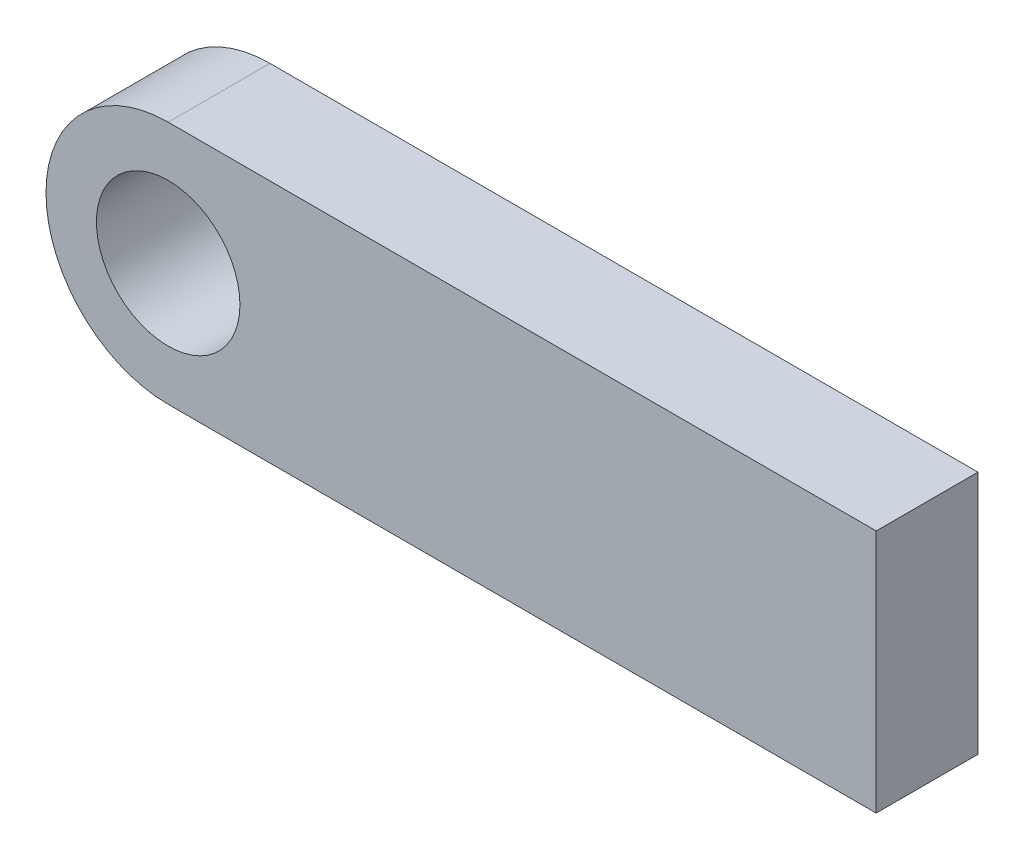
ISO-10303-21;
HEADER;
FILE_DESCRIPTION(('STEP AP214'),'2;1');
FILE_NAME('part.step','',(''),(''),'','','');
FILE_SCHEMA(('AUTOMOTIVE_DESIGN { 1 0 10303 214 1 1 1 1 }'));
ENDSEC;
DATA;
#1=APPLICATION_CONTEXT('core data for automotive mechanical design processes');
#2=APPLICATION_PROTOCOL_DEFINITION('international standard','automotive_design',2000,#1);
#3=PRODUCT_CONTEXT('',#1,'mechanical');
#4=PRODUCT('Part','Part','',(#3));
#5=PRODUCT_RELATED_PRODUCT_CATEGORY('part','',(#4));
#6=PRODUCT_DEFINITION_FORMATION('','',#4);
#7=PRODUCT_DEFINITION_CONTEXT('part definition',#1,'design');
#8=PRODUCT_DEFINITION('design','',#6,#7);
#9=PRODUCT_DEFINITION_SHAPE('','',#8);
#10=(LENGTH_UNIT() NAMED_UNIT(*) SI_UNIT(.MILLI.,.METRE.));
#11=(NAMED_UNIT(*) PLANE_ANGLE_UNIT() SI_UNIT($,.RADIAN.));
#12=(NAMED_UNIT(*) SI_UNIT($,.STERADIAN.) SOLID_ANGLE_UNIT());
#13=UNCERTAINTY_MEASURE_WITH_UNIT(LENGTH_MEASURE(1.E-05),#10,'distance_accuracy_value','');
#14=(GEOMETRIC_REPRESENTATION_CONTEXT(3) GLOBAL_UNCERTAINTY_ASSIGNED_CONTEXT((#13)) GLOBAL_UNIT_ASSIGNED_CONTEXT((#10,
#11,#12)) REPRESENTATION_CONTEXT('',''));
#15=CARTESIAN_POINT('',(0.,0.,0.));
#16=DIRECTION('',(0.,0.,1.));
#17=DIRECTION('',(1.,0.,0.));
#18=AXIS2_PLACEMENT_3D('',#15,#16,#17);
#19=CARTESIAN_POINT('',(0.,6.,2.5));
#20=DIRECTION('',(0.,1.,0.));
#21=DIRECTION('',(0.,0.,1.));
#22=AXIS2_PLACEMENT_3D('',#19,#20,#21);
#23=PLANE('',#22);
#24=DIRECTION('',(1.,0.,0.));
#25=VECTOR('',#24,1.);
#26=CARTESIAN_POINT('',(0.,6.,-2.5));
#27=LINE('',#26,#25);
#28=CARTESIAN_POINT('',(0.,6.,-2.5));
#29=VERTEX_POINT('',#28);
#30=CARTESIAN_POINT('',(34.7702232430035,6.,-2.5));
#31=VERTEX_POINT('',#30);
#32=EDGE_CURVE('E108',#29,#31,#27,.T.);
#33=ORIENTED_EDGE('',*,*,#32,.F.);
#34=DIRECTION('',(0.,0.,-1.));
#35=VECTOR('',#34,1.);
#36=CARTESIAN_POINT('',(0.,6.,2.5));
#37=LINE('',#36,#35);
#38=CARTESIAN_POINT('',(0.,6.,2.5));
#39=VERTEX_POINT('',#38);
#40=EDGE_CURVE('E11',#39,#29,#37,.T.);
#41=ORIENTED_EDGE('',*,*,#40,.F.);
#42=DIRECTION('',(1.,0.,0.));
#43=VECTOR('',#42,1.);
#44=CARTESIAN_POINT('',(0.,6.,2.5));
#45=LINE('',#44,#43);
#46=CARTESIAN_POINT('',(34.7702232430035,6.,2.5));
#47=VERTEX_POINT('',#46);
#48=EDGE_CURVE('E90',#39,#47,#45,.T.);
#49=ORIENTED_EDGE('',*,*,#48,.T.);
#50=DIRECTION('',(0.,0.,-1.));
#51=VECTOR('',#50,1.);
#52=CARTESIAN_POINT('',(34.7702232430035,6.,2.5));
#53=LINE('',#52,#51);
#54=EDGE_CURVE('E58',#47,#31,#53,.T.);
#55=ORIENTED_EDGE('',*,*,#54,.T.);
#56=EDGE_LOOP('',(#33,#41,#49,#55));
#57=FACE_BOUND('',#56,.T.);
#58=ADVANCED_FACE('F41',(#57),#23,.T.);
#59=CARTESIAN_POINT('',(0.,0.,2.5));
#60=DIRECTION('',(0.,0.,-1.));
#61=DIRECTION('',(-1.,0.,0.));
#62=AXIS2_PLACEMENT_3D('',#59,#60,#61);
#63=CYLINDRICAL_SURFACE('',#62,6.);
#64=CARTESIAN_POINT('',(0.,0.,-2.5));
#65=DIRECTION('',(0.,0.,1.));
#66=DIRECTION('',(1.,0.,0.));
#67=AXIS2_PLACEMENT_3D('',#64,#65,#66);
#68=CIRCLE('',#67,6.);
#69=CARTESIAN_POINT('',(0.,-6.,-2.5));
#70=VERTEX_POINT('',#69);
#71=EDGE_CURVE('E96',#29,#70,#68,.T.);
#72=ORIENTED_EDGE('',*,*,#71,.T.);
#73=DIRECTION('',(0.,0.,-1.));
#74=VECTOR('',#73,1.);
#75=CARTESIAN_POINT('',(0.,-6.,2.5));
#76=LINE('',#75,#74);
#77=CARTESIAN_POINT('',(0.,-6.,2.5));
#78=VERTEX_POINT('',#77);
#79=EDGE_CURVE('E50',#78,#70,#76,.T.);
#80=ORIENTED_EDGE('',*,*,#79,.F.);
#81=CARTESIAN_POINT('',(0.,0.,2.5));
#82=DIRECTION('',(0.,0.,1.));
#83=DIRECTION('',(1.,0.,0.));
#84=AXIS2_PLACEMENT_3D('',#81,#82,#83);
#85=CIRCLE('',#84,6.);
#86=EDGE_CURVE('E84',#39,#78,#85,.T.);
#87=ORIENTED_EDGE('',*,*,#86,.F.);
#88=ORIENTED_EDGE('',*,*,#40,.T.);
#89=EDGE_LOOP('',(#72,#80,#87,#88));
#90=FACE_BOUND('',#89,.T.);
#91=ADVANCED_FACE('F94',(#90),#63,.T.);
#92=CARTESIAN_POINT('',(0.,-6.,2.5));
#93=DIRECTION('',(0.,-1.,0.));
#94=DIRECTION('',(0.,0.,-1.));
#95=AXIS2_PLACEMENT_3D('',#92,#93,#94);
#96=PLANE('',#95);
#97=DIRECTION('',(-1.,0.,0.));
#98=VECTOR('',#97,1.);
#99=CARTESIAN_POINT('',(0.,-6.,-2.5));
#100=LINE('',#99,#98);
#101=CARTESIAN_POINT('',(34.7702232430035,-6.,-2.5));
#102=VERTEX_POINT('',#101);
#103=EDGE_CURVE('E111',#102,#70,#100,.T.);
#104=ORIENTED_EDGE('',*,*,#103,.F.);
#105=DIRECTION('',(0.,0.,-1.));
#106=VECTOR('',#105,1.);
#107=CARTESIAN_POINT('',(34.7702232430035,-6.,2.5));
#108=LINE('',#107,#106);
#109=CARTESIAN_POINT('',(34.7702232430035,-6.,2.5));
#110=VERTEX_POINT('',#109);
#111=EDGE_CURVE('E71',#110,#102,#108,.T.);
#112=ORIENTED_EDGE('',*,*,#111,.F.);
#113=DIRECTION('',(-1.,0.,0.));
#114=VECTOR('',#113,1.);
#115=CARTESIAN_POINT('',(0.,-6.,2.5));
#116=LINE('',#115,#114);
#117=EDGE_CURVE('E89',#110,#78,#116,.T.);
#118=ORIENTED_EDGE('',*,*,#117,.T.);
#119=ORIENTED_EDGE('',*,*,#79,.T.);
#120=EDGE_LOOP('',(#104,#112,#118,#119));
#121=FACE_BOUND('',#120,.T.);
#122=ADVANCED_FACE('F99',(#121),#96,.T.);
#123=CARTESIAN_POINT('',(0.,0.,2.5));
#124=DIRECTION('',(0.,0.,-1.));
#125=DIRECTION('',(-1.,0.,0.));
#126=AXIS2_PLACEMENT_3D('',#123,#124,#125);
#127=CYLINDRICAL_SURFACE('',#126,3.5246765451444);
#128=CARTESIAN_POINT('',(0.,0.,2.5));
#129=DIRECTION('',(0.,0.,1.));
#130=DIRECTION('',(1.,0.,0.));
#131=AXIS2_PLACEMENT_3D('',#128,#129,#130);
#132=CIRCLE('',#131,3.5246765451444);
#133=CARTESIAN_POINT('',(3.5246765451444,0.,2.5));
#134=VERTEX_POINT('',#133);
#135=EDGE_CURVE('E116',#134,#134,#132,.T.);
#136=ORIENTED_EDGE('',*,*,#135,.T.);
#137=EDGE_LOOP('',(#136));
#138=FACE_BOUND('',#137,.T.);
#139=CARTESIAN_POINT('',(0.,0.,-2.5));
#140=DIRECTION('',(0.,0.,1.));
#141=DIRECTION('',(1.,0.,0.));
#142=AXIS2_PLACEMENT_3D('',#139,#140,#141);
#143=CIRCLE('',#142,3.5246765451444);
#144=CARTESIAN_POINT('',(3.5246765451444,0.,-2.5));
#145=VERTEX_POINT('',#144);
#146=EDGE_CURVE('E105',#145,#145,#143,.T.);
#147=ORIENTED_EDGE('',*,*,#146,.F.);
#148=EDGE_LOOP('',(#147));
#149=FACE_BOUND('',#148,.T.);
#150=ADVANCED_FACE('F43',(#138,#149),#127,.F.);
#151=CARTESIAN_POINT('',(34.7702232430035,0.,2.5));
#152=DIRECTION('',(1.,0.,0.));
#153=DIRECTION('',(0.,0.,-1.));
#154=AXIS2_PLACEMENT_3D('',#151,#152,#153);
#155=PLANE('',#154);
#156=DIRECTION('',(0.,-1.,0.));
#157=VECTOR('',#156,1.);
#158=CARTESIAN_POINT('',(34.7702232430035,0.,-2.5));
#159=LINE('',#158,#157);
#160=EDGE_CURVE('E113',#31,#102,#159,.T.);
#161=ORIENTED_EDGE('',*,*,#160,.F.);
#162=ORIENTED_EDGE('',*,*,#54,.F.);
#163=DIRECTION('',(0.,-1.,0.));
#164=VECTOR('',#163,1.);
#165=CARTESIAN_POINT('',(34.7702232430035,0.,2.5));
#166=LINE('',#165,#164);
#167=EDGE_CURVE('E100',#47,#110,#166,.T.);
#168=ORIENTED_EDGE('',*,*,#167,.T.);
#169=ORIENTED_EDGE('',*,*,#111,.T.);
#170=EDGE_LOOP('',(#161,#162,#168,#169));
#171=FACE_BOUND('',#170,.T.);
#172=ADVANCED_FACE('F123',(#171),#155,.T.);
#173=CARTESIAN_POINT('',(0.,0.,2.5));
#174=DIRECTION('',(0.,0.,1.));
#175=DIRECTION('',(1.,0.,0.));
#176=AXIS2_PLACEMENT_3D('',#173,#174,#175);
#177=PLANE('',#176);
#178=ORIENTED_EDGE('',*,*,#135,.F.);
#179=EDGE_LOOP('',(#178));
#180=FACE_BOUND('',#179,.T.);
#181=ORIENTED_EDGE('',*,*,#48,.F.);
#182=ORIENTED_EDGE('',*,*,#86,.T.);
#183=ORIENTED_EDGE('',*,*,#117,.F.);
#184=ORIENTED_EDGE('',*,*,#167,.F.);
#185=EDGE_LOOP('',(#181,#182,#183,#184));
#186=FACE_BOUND('',#185,.T.);
#187=ADVANCED_FACE('F86',(#180,#186),#177,.T.);
#188=CARTESIAN_POINT('',(0.,0.,-2.5));
#189=DIRECTION('',(0.,0.,1.));
#190=DIRECTION('',(1.,0.,0.));
#191=AXIS2_PLACEMENT_3D('',#188,#189,#190);
#192=PLANE('',#191);
#193=ORIENTED_EDGE('',*,*,#146,.T.);
#194=EDGE_LOOP('',(#193));
#195=FACE_BOUND('',#194,.T.);
#196=ORIENTED_EDGE('',*,*,#32,.T.);
#197=ORIENTED_EDGE('',*,*,#160,.T.);
#198=ORIENTED_EDGE('',*,*,#103,.T.);
#199=ORIENTED_EDGE('',*,*,#71,.F.);
#200=EDGE_LOOP('',(#196,#197,#198,#199));
#201=FACE_BOUND('',#200,.T.);
#202=ADVANCED_FACE('F130',(#195,#201),#192,.F.);
#203=CLOSED_SHELL('',(#58,#91,#122,#150,#172,#187,#202));
#204=MANIFOLD_SOLID_BREP('B2',#203);
#205=ADVANCED_BREP_SHAPE_REPRESENTATION('',(#18,#204),#14);
#206=SHAPE_DEFINITION_REPRESENTATION(#9,#205);
ENDSEC;
END-ISO-10303-21;
